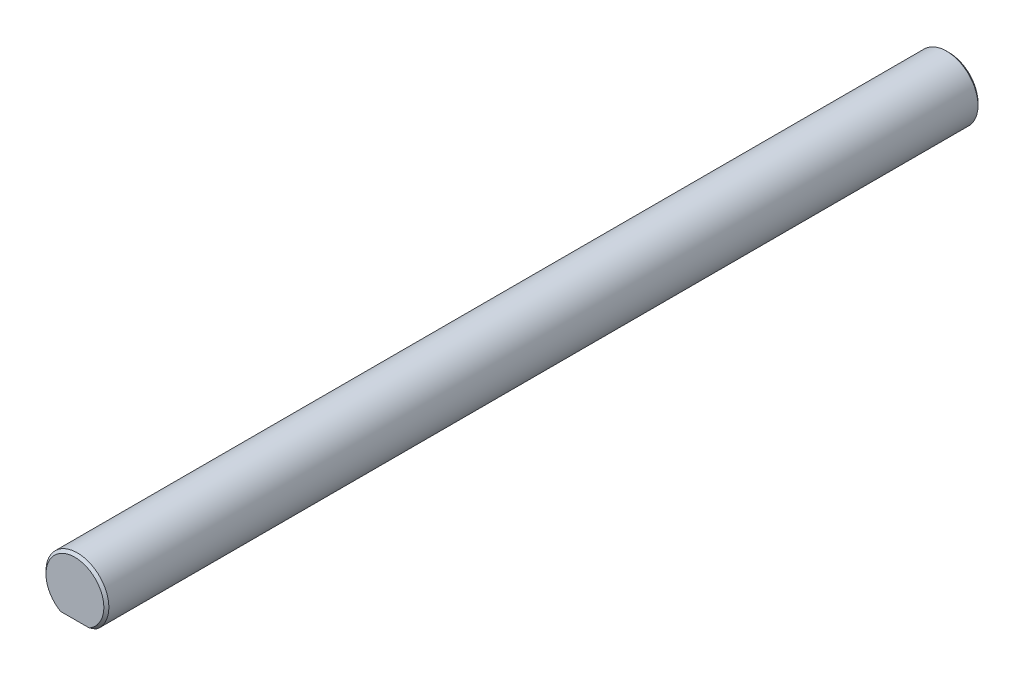
ISO-10303-21;
HEADER;
FILE_DESCRIPTION(('STEP AP214'),'2;1');
FILE_NAME('part.step','',(''),(''),'','','');
FILE_SCHEMA(('AUTOMOTIVE_DESIGN { 1 0 10303 214 1 1 1 1 }'));
ENDSEC;
DATA;
#1=APPLICATION_CONTEXT('core data for automotive mechanical design processes');
#2=APPLICATION_PROTOCOL_DEFINITION('international standard','automotive_design',2000,#1);
#3=PRODUCT_CONTEXT('',#1,'mechanical');
#4=PRODUCT('Part','Part','',(#3));
#5=PRODUCT_RELATED_PRODUCT_CATEGORY('part','',(#4));
#6=PRODUCT_DEFINITION_FORMATION('','',#4);
#7=PRODUCT_DEFINITION_CONTEXT('part definition',#1,'design');
#8=PRODUCT_DEFINITION('design','',#6,#7);
#9=PRODUCT_DEFINITION_SHAPE('','',#8);
#10=(LENGTH_UNIT() NAMED_UNIT(*) SI_UNIT(.MILLI.,.METRE.));
#11=(NAMED_UNIT(*) PLANE_ANGLE_UNIT() SI_UNIT($,.RADIAN.));
#12=(NAMED_UNIT(*) SI_UNIT($,.STERADIAN.) SOLID_ANGLE_UNIT());
#13=UNCERTAINTY_MEASURE_WITH_UNIT(LENGTH_MEASURE(1.E-05),#10,'distance_accuracy_value','');
#14=(GEOMETRIC_REPRESENTATION_CONTEXT(3) GLOBAL_UNCERTAINTY_ASSIGNED_CONTEXT((#13)) GLOBAL_UNIT_ASSIGNED_CONTEXT((#10,
#11,#12)) REPRESENTATION_CONTEXT('',''));
#15=CARTESIAN_POINT('',(0.,0.,0.));
#16=DIRECTION('',(0.,0.,1.));
#17=DIRECTION('',(1.,0.,0.));
#18=AXIS2_PLACEMENT_3D('',#15,#16,#17);
#19=CARTESIAN_POINT('',(0.,-2.25,7.5));
#20=DIRECTION('',(0.,0.,1.));
#21=DIRECTION('',(1.,0.,0.));
#22=AXIS2_PLACEMENT_3D('',#19,#20,#21);
#23=PLANE('',#22);
#24=DIRECTION('',(1.,0.,0.));
#25=VECTOR('',#24,1.);
#26=CARTESIAN_POINT('',(0.75,-2.,7.5));
#27=LINE('',#26,#25);
#28=CARTESIAN_POINT('',(-1.5,-2.,7.5));
#29=VERTEX_POINT('',#28);
#30=CARTESIAN_POINT('',(1.5,-2.,7.5));
#31=VERTEX_POINT('',#30);
#32=EDGE_CURVE('E10',#29,#31,#27,.T.);
#33=ORIENTED_EDGE('',*,*,#32,.F.);
#34=CARTESIAN_POINT('',(0.,0.,7.5));
#35=DIRECTION('',(0.,0.,-1.));
#36=DIRECTION('',(1.,0.,0.));
#37=AXIS2_PLACEMENT_3D('',#34,#35,#36);
#38=CIRCLE('',#37,2.5);
#39=EDGE_CURVE('E64',#31,#29,#38,.T.);
#40=ORIENTED_EDGE('',*,*,#39,.F.);
#41=EDGE_LOOP('',(#33,#40));
#42=FACE_BOUND('',#41,.T.);
#43=ADVANCED_FACE('F16',(#42),#23,.T.);
#44=CARTESIAN_POINT('',(-1.5,-2.,25.));
#45=DIRECTION('',(0.,1.,0.));
#46=DIRECTION('',(1.,0.,0.));
#47=AXIS2_PLACEMENT_3D('',#44,#45,#46);
#48=PLANE('',#47);
#49=CARTESIAN_POINT('',(1.13578166916006,-2.,25.));
#50=CARTESIAN_POINT('',(1.31030295268753,-2.,24.9138182283875));
#51=CARTESIAN_POINT('',(1.5,-2.,24.8));
#52=(BOUNDED_CURVE() B_SPLINE_CURVE(2,(#49,#50,#51),.UNSPECIFIED.,.F.,
.F.) B_SPLINE_CURVE_WITH_KNOTS((3,3),(0.,0.130547623104732),
.UNSPECIFIED.) CURVE() GEOMETRIC_REPRESENTATION_ITEM() RATIONAL_B_SPLINE_CURVE((1.,
1.04309520975941,1.08178307893013)) REPRESENTATION_ITEM(''));
#53=CARTESIAN_POINT('',(1.13578166916005,-2.,25.));
#54=VERTEX_POINT('',#53);
#55=CARTESIAN_POINT('',(1.5,-2.,24.8));
#56=VERTEX_POINT('',#55);
#57=EDGE_CURVE('E19',#54,#56,#52,.T.);
#58=ORIENTED_EDGE('',*,*,#57,.F.);
#59=DIRECTION('',(1.,0.,0.));
#60=VECTOR('',#59,1.);
#61=CARTESIAN_POINT('',(-0.75,-2.,25.));
#62=LINE('',#61,#60);
#63=CARTESIAN_POINT('',(-1.13578166916005,-2.,25.));
#64=VERTEX_POINT('',#63);
#65=EDGE_CURVE('E27',#64,#54,#62,.T.);
#66=ORIENTED_EDGE('',*,*,#65,.F.);
#67=CARTESIAN_POINT('',(-1.5,-2.,24.8));
#68=CARTESIAN_POINT('',(-1.31030295269155,-2.,24.9138182283847));
#69=CARTESIAN_POINT('',(-1.13578166916006,-2.,25.));
#70=(BOUNDED_CURVE() B_SPLINE_CURVE(2,(#67,#68,#69),.UNSPECIFIED.,.F.,
.F.) B_SPLINE_CURVE_WITH_KNOTS((3,3),(2.42245552611172,2.5530031492138),
.UNSPECIFIED.) CURVE() GEOMETRIC_REPRESENTATION_ITEM() RATIONAL_B_SPLINE_CURVE((1.08178307892856,
1.04309520975854,1.)) REPRESENTATION_ITEM(''));
#71=CARTESIAN_POINT('',(-1.5,-2.,24.8));
#72=VERTEX_POINT('',#71);
#73=EDGE_CURVE('E71',#72,#64,#70,.T.);
#74=ORIENTED_EDGE('',*,*,#73,.F.);
#75=DIRECTION('',(0.,0.,1.));
#76=VECTOR('',#75,1.);
#77=CARTESIAN_POINT('',(-1.5,-2.,0.));
#78=LINE('',#77,#76);
#79=EDGE_CURVE('E68',#29,#72,#78,.T.);
#80=ORIENTED_EDGE('',*,*,#79,.F.);
#81=ORIENTED_EDGE('',*,*,#32,.T.);
#82=DIRECTION('',(0.,0.,-1.));
#83=VECTOR('',#82,1.);
#84=CARTESIAN_POINT('',(1.5,-2.,0.));
#85=LINE('',#84,#83);
#86=EDGE_CURVE('E77',#56,#31,#85,.T.);
#87=ORIENTED_EDGE('',*,*,#86,.F.);
#88=EDGE_LOOP('',(#58,#66,#74,#80,#81,#87));
#89=FACE_BOUND('',#88,.T.);
#90=ADVANCED_FACE('F69',(#89),#48,.F.);
#91=CARTESIAN_POINT('',(0.,0.,25.));
#92=DIRECTION('',(0.,0.,1.));
#93=DIRECTION('',(1.,0.,0.));
#94=AXIS2_PLACEMENT_3D('',#91,#92,#93);
#95=PLANE('',#94);
#96=CARTESIAN_POINT('',(0.,0.,25.));
#97=DIRECTION('',(0.,0.,-1.));
#98=DIRECTION('',(1.,0.,0.));
#99=AXIS2_PLACEMENT_3D('',#96,#97,#98);
#100=CIRCLE('',#99,2.3);
#101=EDGE_CURVE('E92',#64,#54,#100,.T.);
#102=ORIENTED_EDGE('',*,*,#101,.F.);
#103=ORIENTED_EDGE('',*,*,#65,.T.);
#104=EDGE_LOOP('',(#102,#103));
#105=FACE_BOUND('',#104,.T.);
#106=ADVANCED_FACE('F128',(#105),#95,.T.);
#107=CARTESIAN_POINT('',(0.,0.,24.9));
#108=DIRECTION('',(0.,0.,-1.));
#109=DIRECTION('',(0.,1.,0.));
#110=AXIS2_PLACEMENT_3D('',#107,#108,#109);
#111=CONICAL_SURFACE('',#110,2.4,0.785398163397448);
#112=ORIENTED_EDGE('',*,*,#73,.T.);
#113=ORIENTED_EDGE('',*,*,#101,.T.);
#114=ORIENTED_EDGE('',*,*,#57,.T.);
#115=CARTESIAN_POINT('',(0.,0.,24.8));
#116=DIRECTION('',(0.,0.,1.));
#117=DIRECTION('',(1.,0.,0.));
#118=AXIS2_PLACEMENT_3D('',#115,#116,#117);
#119=CIRCLE('',#118,2.5);
#120=EDGE_CURVE('E83',#56,#72,#119,.T.);
#121=ORIENTED_EDGE('',*,*,#120,.T.);
#122=EDGE_LOOP('',(#112,#113,#114,#121));
#123=FACE_BOUND('',#122,.T.);
#124=ADVANCED_FACE('F102',(#123),#111,.T.);
#125=CARTESIAN_POINT('',(0.,0.,0.));
#126=DIRECTION('',(0.,0.,1.));
#127=DIRECTION('',(1.,0.,0.));
#128=AXIS2_PLACEMENT_3D('',#125,#126,#127);
#129=CYLINDRICAL_SURFACE('',#128,2.5);
#130=CARTESIAN_POINT('',(0.,0.,-44.3));
#131=DIRECTION('',(0.,0.,-1.));
#132=DIRECTION('',(1.,0.,0.));
#133=AXIS2_PLACEMENT_3D('',#130,#131,#132);
#134=CIRCLE('',#133,2.5);
#135=CARTESIAN_POINT('',(2.5,0.,-44.3));
#136=VERTEX_POINT('',#135);
#137=EDGE_CURVE('E109',#136,#136,#134,.T.);
#138=ORIENTED_EDGE('',*,*,#137,.F.);
#139=EDGE_LOOP('',(#138));
#140=FACE_BOUND('',#139,.T.);
#141=ORIENTED_EDGE('',*,*,#120,.F.);
#142=ORIENTED_EDGE('',*,*,#86,.T.);
#143=ORIENTED_EDGE('',*,*,#39,.T.);
#144=ORIENTED_EDGE('',*,*,#79,.T.);
#145=EDGE_LOOP('',(#141,#142,#143,#144));
#146=FACE_BOUND('',#145,.T.);
#147=ADVANCED_FACE('F76',(#140,#146),#129,.T.);
#148=CARTESIAN_POINT('',(0.,0.,-44.5));
#149=DIRECTION('',(0.,0.,-1.));
#150=DIRECTION('',(0.,-1.,0.));
#151=AXIS2_PLACEMENT_3D('',#148,#149,#150);
#152=PLANE('',#151);
#153=CARTESIAN_POINT('',(0.,0.,-44.5));
#154=DIRECTION('',(0.,0.,1.));
#155=DIRECTION('',(1.,0.,0.));
#156=AXIS2_PLACEMENT_3D('',#153,#154,#155);
#157=CIRCLE('',#156,2.3);
#158=CARTESIAN_POINT('',(2.3,0.,-44.5));
#159=VERTEX_POINT('',#158);
#160=EDGE_CURVE('E104',#159,#159,#157,.T.);
#161=ORIENTED_EDGE('',*,*,#160,.F.);
#162=EDGE_LOOP('',(#161));
#163=FACE_BOUND('',#162,.T.);
#164=ADVANCED_FACE('F119',(#163),#152,.T.);
#165=CARTESIAN_POINT('',(0.,0.,-44.4));
#166=DIRECTION('',(0.,0.,1.));
#167=DIRECTION('',(1.,0.,0.));
#168=AXIS2_PLACEMENT_3D('',#165,#166,#167);
#169=CONICAL_SURFACE('',#168,2.4,0.785398163397459);
#170=ORIENTED_EDGE('',*,*,#160,.T.);
#171=EDGE_LOOP('',(#170));
#172=FACE_BOUND('',#171,.T.);
#173=ORIENTED_EDGE('',*,*,#137,.T.);
#174=EDGE_LOOP('',(#173));
#175=FACE_BOUND('',#174,.T.);
#176=ADVANCED_FACE('F116',(#172,#175),#169,.T.);
#177=CLOSED_SHELL('',(#43,#90,#106,#124,#147,#164,#176));
#178=MANIFOLD_SOLID_BREP('B1',#177);
#179=ADVANCED_BREP_SHAPE_REPRESENTATION('',(#18,#178),#14);
#180=SHAPE_DEFINITION_REPRESENTATION(#9,#179);
ENDSEC;
END-ISO-10303-21;
